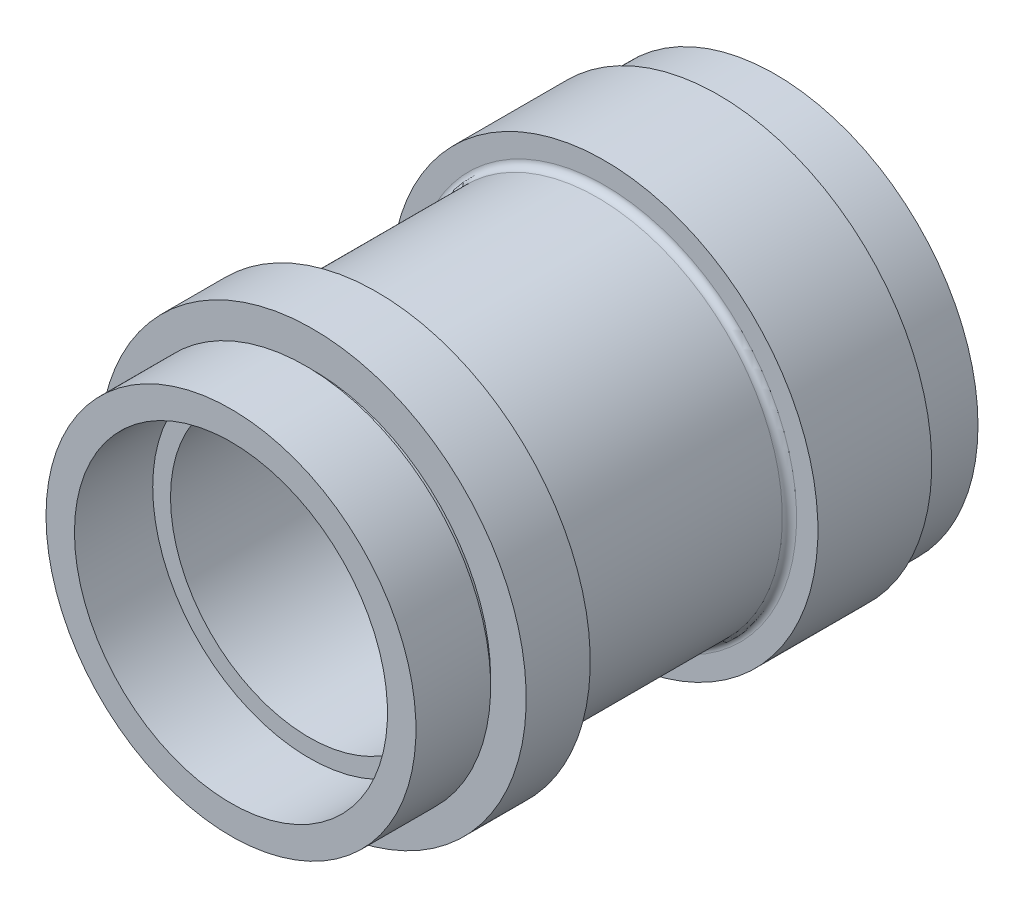
ISO-10303-21;
HEADER;
FILE_DESCRIPTION(('STEP AP214'),'2;1');
FILE_NAME('part.step','',(''),(''),'','','');
FILE_SCHEMA(('AUTOMOTIVE_DESIGN { 1 0 10303 214 1 1 1 1 }'));
ENDSEC;
DATA;
#1=APPLICATION_CONTEXT('core data for automotive mechanical design processes');
#2=APPLICATION_PROTOCOL_DEFINITION('international standard','automotive_design',2000,#1);
#3=PRODUCT_CONTEXT('',#1,'mechanical');
#4=PRODUCT('Part','Part','',(#3));
#5=PRODUCT_RELATED_PRODUCT_CATEGORY('part','',(#4));
#6=PRODUCT_DEFINITION_FORMATION('','',#4);
#7=PRODUCT_DEFINITION_CONTEXT('part definition',#1,'design');
#8=PRODUCT_DEFINITION('design','',#6,#7);
#9=PRODUCT_DEFINITION_SHAPE('','',#8);
#10=(LENGTH_UNIT() NAMED_UNIT(*) SI_UNIT(.MILLI.,.METRE.));
#11=(NAMED_UNIT(*) PLANE_ANGLE_UNIT() SI_UNIT($,.RADIAN.));
#12=(NAMED_UNIT(*) SI_UNIT($,.STERADIAN.) SOLID_ANGLE_UNIT());
#13=UNCERTAINTY_MEASURE_WITH_UNIT(LENGTH_MEASURE(1.E-05),#10,'distance_accuracy_value','');
#14=(GEOMETRIC_REPRESENTATION_CONTEXT(3) GLOBAL_UNCERTAINTY_ASSIGNED_CONTEXT((#13)) GLOBAL_UNIT_ASSIGNED_CONTEXT((#10,
#11,#12)) REPRESENTATION_CONTEXT('',''));
#15=CARTESIAN_POINT('',(0.,0.,0.));
#16=DIRECTION('',(0.,0.,1.));
#17=DIRECTION('',(1.,0.,0.));
#18=AXIS2_PLACEMENT_3D('',#15,#16,#17);
#19=CARTESIAN_POINT('',(0.,0.,32.5));
#20=DIRECTION('',(0.,0.,-1.));
#21=DIRECTION('',(-1.,0.,0.));
#22=AXIS2_PLACEMENT_3D('',#19,#20,#21);
#23=CYLINDRICAL_SURFACE('',#22,15.);
#24=CARTESIAN_POINT('',(0.,0.,28.));
#25=DIRECTION('',(0.,0.,-1.));
#26=DIRECTION('',(-1.,0.,0.));
#27=AXIS2_PLACEMENT_3D('',#24,#25,#26);
#28=CIRCLE('',#27,15.);
#29=CARTESIAN_POINT('',(-15.,0.,28.));
#30=VERTEX_POINT('',#29);
#31=EDGE_CURVE('E93',#30,#30,#28,.T.);
#32=CARTESIAN_POINT('',(0.,0.,32.5));
#33=DIRECTION('',(0.,0.,1.));
#34=DIRECTION('',(1.,0.,0.));
#35=AXIS2_PLACEMENT_3D('',#32,#33,#34);
#36=CIRCLE('',#35,15.);
#37=CARTESIAN_POINT('',(-15.,0.,32.5));
#38=VERTEX_POINT('',#37);
#39=EDGE_CURVE('E118',#38,#38,#36,.T.);
#40=CARTESIAN_POINT('',(-15.,0.,28.));
#41=CARTESIAN_POINT('',(-15.,0.,28.046875));
#42=CARTESIAN_POINT('',(-15.,0.,28.09375));
#43=CARTESIAN_POINT('',(-15.,0.,28.1875));
#44=CARTESIAN_POINT('',(-15.,0.,28.234375));
#45=CARTESIAN_POINT('',(-15.,0.,28.328125));
#46=CARTESIAN_POINT('',(-15.,0.,28.375));
#47=CARTESIAN_POINT('',(-15.,0.,28.46875));
#48=CARTESIAN_POINT('',(-15.,0.,28.515625));
#49=CARTESIAN_POINT('',(-15.,0.,28.609375));
#50=CARTESIAN_POINT('',(-15.,0.,28.65625));
#51=CARTESIAN_POINT('',(-15.,0.,28.75));
#52=CARTESIAN_POINT('',(-15.,0.,28.796875));
#53=CARTESIAN_POINT('',(-15.,0.,28.890625));
#54=CARTESIAN_POINT('',(-15.,0.,28.9375));
#55=CARTESIAN_POINT('',(-15.,0.,29.03125));
#56=CARTESIAN_POINT('',(-15.,0.,29.078125));
#57=CARTESIAN_POINT('',(-15.,0.,29.171875));
#58=CARTESIAN_POINT('',(-15.,0.,29.21875));
#59=CARTESIAN_POINT('',(-15.,0.,29.3125));
#60=CARTESIAN_POINT('',(-15.,0.,29.359375));
#61=CARTESIAN_POINT('',(-15.,0.,29.453125));
#62=CARTESIAN_POINT('',(-15.,0.,29.5));
#63=CARTESIAN_POINT('',(-15.,0.,29.59375));
#64=CARTESIAN_POINT('',(-15.,0.,29.640625));
#65=CARTESIAN_POINT('',(-15.,0.,29.734375));
#66=CARTESIAN_POINT('',(-15.,0.,29.78125));
#67=CARTESIAN_POINT('',(-15.,0.,29.875));
#68=CARTESIAN_POINT('',(-15.,0.,29.921875));
#69=CARTESIAN_POINT('',(-15.,0.,30.015625));
#70=CARTESIAN_POINT('',(-15.,0.,30.0625));
#71=CARTESIAN_POINT('',(-15.,0.,30.15625));
#72=CARTESIAN_POINT('',(-15.,0.,30.203125));
#73=CARTESIAN_POINT('',(-15.,0.,30.296875));
#74=CARTESIAN_POINT('',(-15.,0.,30.34375));
#75=CARTESIAN_POINT('',(-15.,0.,30.4375));
#76=CARTESIAN_POINT('',(-15.,0.,30.484375));
#77=CARTESIAN_POINT('',(-15.,0.,30.578125));
#78=CARTESIAN_POINT('',(-15.,0.,30.625));
#79=CARTESIAN_POINT('',(-15.,0.,30.71875));
#80=CARTESIAN_POINT('',(-15.,0.,30.765625));
#81=CARTESIAN_POINT('',(-15.,0.,30.859375));
#82=CARTESIAN_POINT('',(-15.,0.,30.90625));
#83=CARTESIAN_POINT('',(-15.,0.,31.));
#84=CARTESIAN_POINT('',(-15.,0.,31.046875));
#85=CARTESIAN_POINT('',(-15.,0.,31.140625));
#86=CARTESIAN_POINT('',(-15.,0.,31.1875));
#87=CARTESIAN_POINT('',(-15.,0.,31.28125));
#88=CARTESIAN_POINT('',(-15.,0.,31.328125));
#89=CARTESIAN_POINT('',(-15.,0.,31.421875));
#90=CARTESIAN_POINT('',(-15.,0.,31.46875));
#91=CARTESIAN_POINT('',(-15.,0.,31.5625));
#92=CARTESIAN_POINT('',(-15.,0.,31.609375));
#93=CARTESIAN_POINT('',(-15.,0.,31.703125));
#94=CARTESIAN_POINT('',(-15.,0.,31.75));
#95=CARTESIAN_POINT('',(-15.,0.,31.84375));
#96=CARTESIAN_POINT('',(-15.,0.,31.890625));
#97=CARTESIAN_POINT('',(-15.,0.,31.984375));
#98=CARTESIAN_POINT('',(-15.,0.,32.03125));
#99=CARTESIAN_POINT('',(-15.,0.,32.125));
#100=CARTESIAN_POINT('',(-15.,0.,32.171875));
#101=CARTESIAN_POINT('',(-15.,0.,32.265625));
#102=CARTESIAN_POINT('',(-15.,0.,32.3125));
#103=CARTESIAN_POINT('',(-15.,0.,32.40625));
#104=CARTESIAN_POINT('',(-15.,0.,32.453125));
#105=CARTESIAN_POINT('',(-15.,0.,32.5));
#106=B_SPLINE_CURVE_WITH_KNOTS('',3,(#40,#41,#42,#43,#44,#45,#46,#47,#48,#49,#50,#51,#52,#53,
#54,#55,#56,#57,#58,#59,#60,#61,#62,#63,#64,#65,#66,#67,#68,#69,#70,#71,#72,#73,#74,#75,#76,#77,
#78,#79,#80,#81,#82,#83,#84,#85,#86,#87,#88,#89,#90,#91,#92,#93,#94,#95,#96,#97,#98,#99,#100,
#101,#102,#103,#104,#105),.UNSPECIFIED.,.F.,.F.,(4,2,2,2,2,2,2,2,2,2,2,2,2,2,2,2,2,2,2,2,2,2,2,
2,2,2,2,2,2,2,2,2,4),(0.,0.140624999999998,0.28125,0.421874999999999,0.562499999999997,
0.703124999999999,0.843749999999997,0.984374999999996,1.125,1.265625,1.40624999999999,1.546875,
1.68749999999999,1.828125,1.96874999999999,2.10937499999999,2.25,2.39062499999999,2.53125,
2.67187499999999,2.81249999999999,2.95312499999999,3.09374999999999,3.23437499999999,
3.37499999999999,3.51562499999999,3.65624999999999,3.79687499999999,3.93749999999999,
4.07812499999999,4.21874999999999,4.35937499999999,4.49999999999999),.UNSPECIFIED.);
#107=EDGE_CURVE('BSEAM51',#30,#38,#106,.T.);
#108=ORIENTED_EDGE('',*,*,#31,.F.);
#109=ORIENTED_EDGE('',*,*,#39,.F.);
#110=ORIENTED_EDGE('',*,*,#107,.T.);
#111=ORIENTED_EDGE('',*,*,#107,.F.);
#112=EDGE_LOOP('',(#108,#110,#109,#111));
#113=FACE_BOUND('',#112,.T.);
#114=ADVANCED_FACE('F51',(#113),#23,.T.);
#115=CARTESIAN_POINT('',(0.,0.,32.5));
#116=DIRECTION('',(0.,0.,1.));
#117=DIRECTION('',(1.,0.,0.));
#118=AXIS2_PLACEMENT_3D('',#115,#116,#117);
#119=PLANE('',#118);
#120=CARTESIAN_POINT('',(0.,0.,32.5));
#121=DIRECTION('',(0.,0.,1.));
#122=DIRECTION('',(1.,0.,0.));
#123=AXIS2_PLACEMENT_3D('',#120,#121,#122);
#124=CIRCLE('',#123,12.5);
#125=CARTESIAN_POINT('',(12.5,0.,32.5));
#126=VERTEX_POINT('',#125);
#127=EDGE_CURVE('E11',#126,#126,#124,.T.);
#128=ORIENTED_EDGE('',*,*,#127,.F.);
#129=EDGE_LOOP('',(#128));
#130=FACE_BOUND('',#129,.T.);
#131=ORIENTED_EDGE('',*,*,#39,.T.);
#132=EDGE_LOOP('',(#131));
#133=FACE_BOUND('',#132,.T.);
#134=ADVANCED_FACE('F147',(#130,#133),#119,.T.);
#135=CARTESIAN_POINT('',(0.,0.,33.));
#136=DIRECTION('',(0.,0.,-1.));
#137=DIRECTION('',(-1.,0.,0.));
#138=AXIS2_PLACEMENT_3D('',#135,#136,#137);
#139=CYLINDRICAL_SURFACE('',#138,12.5);
#140=CARTESIAN_POINT('',(0.,0.,33.));
#141=DIRECTION('',(0.,0.,1.));
#142=DIRECTION('',(1.,0.,0.));
#143=AXIS2_PLACEMENT_3D('',#140,#141,#142);
#144=CIRCLE('',#143,12.5);
#145=CARTESIAN_POINT('',(12.5,0.,33.));
#146=VERTEX_POINT('',#145);
#147=EDGE_CURVE('E112',#146,#146,#144,.T.);
#148=ORIENTED_EDGE('',*,*,#147,.F.);
#149=EDGE_LOOP('',(#148));
#150=FACE_BOUND('',#149,.T.);
#151=ORIENTED_EDGE('',*,*,#127,.T.);
#152=EDGE_LOOP('',(#151));
#153=FACE_BOUND('',#152,.T.);
#154=ADVANCED_FACE('F154',(#150,#153),#139,.T.);
#155=CARTESIAN_POINT('',(0.,0.,38.25));
#156=DIRECTION('',(0.,0.,-1.));
#157=DIRECTION('',(-1.,0.,0.));
#158=AXIS2_PLACEMENT_3D('',#155,#156,#157);
#159=CYLINDRICAL_SURFACE('',#158,13.);
#160=CARTESIAN_POINT('',(0.,0.,38.25));
#161=DIRECTION('',(0.,0.,1.));
#162=DIRECTION('',(1.,0.,0.));
#163=AXIS2_PLACEMENT_3D('',#160,#161,#162);
#164=CIRCLE('',#163,13.);
#165=CARTESIAN_POINT('',(-13.,0.,38.25));
#166=VERTEX_POINT('',#165);
#167=EDGE_CURVE('E109',#166,#166,#164,.T.);
#168=CARTESIAN_POINT('',(0.,0.,33.));
#169=DIRECTION('',(0.,0.,1.));
#170=DIRECTION('',(1.,0.,0.));
#171=AXIS2_PLACEMENT_3D('',#168,#169,#170);
#172=CIRCLE('',#171,13.);
#173=CARTESIAN_POINT('',(-13.,0.,33.));
#174=VERTEX_POINT('',#173);
#175=EDGE_CURVE('E108',#174,#174,#172,.T.);
#176=CARTESIAN_POINT('',(-13.,0.,38.25));
#177=CARTESIAN_POINT('',(-13.,0.,38.1953125));
#178=CARTESIAN_POINT('',(-13.,0.,38.140625));
#179=CARTESIAN_POINT('',(-13.,0.,38.03125));
#180=CARTESIAN_POINT('',(-13.,0.,37.9765625));
#181=CARTESIAN_POINT('',(-13.,0.,37.8671875));
#182=CARTESIAN_POINT('',(-13.,0.,37.8125));
#183=CARTESIAN_POINT('',(-13.,0.,37.703125));
#184=CARTESIAN_POINT('',(-13.,0.,37.6484375));
#185=CARTESIAN_POINT('',(-13.,0.,37.5390625));
#186=CARTESIAN_POINT('',(-13.,0.,37.484375));
#187=CARTESIAN_POINT('',(-13.,0.,37.375));
#188=CARTESIAN_POINT('',(-13.,0.,37.3203125));
#189=CARTESIAN_POINT('',(-13.,0.,37.2109375));
#190=CARTESIAN_POINT('',(-13.,0.,37.15625));
#191=CARTESIAN_POINT('',(-13.,0.,37.046875));
#192=CARTESIAN_POINT('',(-13.,0.,36.9921875));
#193=CARTESIAN_POINT('',(-13.,0.,36.8828125));
#194=CARTESIAN_POINT('',(-13.,0.,36.828125));
#195=CARTESIAN_POINT('',(-13.,0.,36.71875));
#196=CARTESIAN_POINT('',(-13.,0.,36.6640625));
#197=CARTESIAN_POINT('',(-13.,0.,36.5546875));
#198=CARTESIAN_POINT('',(-13.,0.,36.5));
#199=CARTESIAN_POINT('',(-13.,0.,36.390625));
#200=CARTESIAN_POINT('',(-13.,0.,36.3359375));
#201=CARTESIAN_POINT('',(-13.,0.,36.2265625));
#202=CARTESIAN_POINT('',(-13.,0.,36.171875));
#203=CARTESIAN_POINT('',(-13.,0.,36.0625));
#204=CARTESIAN_POINT('',(-13.,0.,36.0078125));
#205=CARTESIAN_POINT('',(-13.,0.,35.8984375));
#206=CARTESIAN_POINT('',(-13.,0.,35.84375));
#207=CARTESIAN_POINT('',(-13.,0.,35.734375));
#208=CARTESIAN_POINT('',(-13.,0.,35.6796875));
#209=CARTESIAN_POINT('',(-13.,0.,35.5703125));
#210=CARTESIAN_POINT('',(-13.,0.,35.515625));
#211=CARTESIAN_POINT('',(-13.,0.,35.40625));
#212=CARTESIAN_POINT('',(-13.,0.,35.3515625));
#213=CARTESIAN_POINT('',(-13.,0.,35.2421875));
#214=CARTESIAN_POINT('',(-13.,0.,35.1875));
#215=CARTESIAN_POINT('',(-13.,0.,35.078125));
#216=CARTESIAN_POINT('',(-13.,0.,35.0234375));
#217=CARTESIAN_POINT('',(-13.,0.,34.9140625));
#218=CARTESIAN_POINT('',(-13.,0.,34.859375));
#219=CARTESIAN_POINT('',(-13.,0.,34.75));
#220=CARTESIAN_POINT('',(-13.,0.,34.6953125));
#221=CARTESIAN_POINT('',(-13.,0.,34.5859375));
#222=CARTESIAN_POINT('',(-13.,0.,34.53125));
#223=CARTESIAN_POINT('',(-13.,0.,34.421875));
#224=CARTESIAN_POINT('',(-13.,0.,34.3671875));
#225=CARTESIAN_POINT('',(-13.,0.,34.2578125));
#226=CARTESIAN_POINT('',(-13.,0.,34.203125));
#227=CARTESIAN_POINT('',(-13.,0.,34.09375));
#228=CARTESIAN_POINT('',(-13.,0.,34.0390625));
#229=CARTESIAN_POINT('',(-13.,0.,33.9296875));
#230=CARTESIAN_POINT('',(-13.,0.,33.875));
#231=CARTESIAN_POINT('',(-13.,0.,33.765625));
#232=CARTESIAN_POINT('',(-13.,0.,33.7109375));
#233=CARTESIAN_POINT('',(-13.,0.,33.6015625));
#234=CARTESIAN_POINT('',(-13.,0.,33.546875));
#235=CARTESIAN_POINT('',(-13.,0.,33.4375));
#236=CARTESIAN_POINT('',(-13.,0.,33.3828125));
#237=CARTESIAN_POINT('',(-13.,0.,33.2734375));
#238=CARTESIAN_POINT('',(-13.,0.,33.21875));
#239=CARTESIAN_POINT('',(-13.,0.,33.109375));
#240=CARTESIAN_POINT('',(-13.,0.,33.0546875));
#241=CARTESIAN_POINT('',(-13.,0.,33.));
#242=B_SPLINE_CURVE_WITH_KNOTS('',3,(#176,#177,#178,#179,#180,#181,#182,#183,#184,#185,#186,
#187,#188,#189,#190,#191,#192,#193,#194,#195,#196,#197,#198,#199,#200,#201,#202,#203,#204,#205,
#206,#207,#208,#209,#210,#211,#212,#213,#214,#215,#216,#217,#218,#219,#220,#221,#222,#223,#224,
#225,#226,#227,#228,#229,#230,#231,#232,#233,#234,#235,#236,#237,#238,#239,#240,#241),
.UNSPECIFIED.,.F.,.F.,(4,2,2,2,2,2,2,2,2,2,2,2,2,2,2,2,2,2,2,2,2,2,2,2,2,2,2,2,2,2,2,2,4),(0.,
0.164062500000006,0.328125000000005,0.492187500000005,0.656250000000004,0.820312500000003,
0.984375000000003,1.1484375,1.3125,1.4765625,1.640625,1.80468750000001,1.96875000000001,
2.1328125,2.296875,2.4609375,2.625,2.7890625,2.953125,3.1171875,3.28125,3.44531250000001,
3.609375,3.7734375,3.9375,4.1015625,4.265625,4.4296875,4.59375,4.7578125,4.921875,
5.08593750000001,5.25),.UNSPECIFIED.);
#243=EDGE_CURVE('BSEAM211',#166,#174,#242,.T.);
#244=ORIENTED_EDGE('',*,*,#167,.F.);
#245=ORIENTED_EDGE('',*,*,#175,.T.);
#246=ORIENTED_EDGE('',*,*,#243,.T.);
#247=ORIENTED_EDGE('',*,*,#243,.F.);
#248=EDGE_LOOP('',(#244,#246,#245,#247));
#249=FACE_BOUND('',#248,.T.);
#250=ADVANCED_FACE('F211',(#249),#159,.T.);
#251=CARTESIAN_POINT('',(0.,0.,38.25));
#252=DIRECTION('',(0.,0.,1.));
#253=DIRECTION('',(1.,0.,0.));
#254=AXIS2_PLACEMENT_3D('',#251,#252,#253);
#255=PLANE('',#254);
#256=CARTESIAN_POINT('',(0.,0.,38.25));
#257=DIRECTION('',(0.,0.,-1.));
#258=DIRECTION('',(-1.,0.,0.));
#259=AXIS2_PLACEMENT_3D('',#256,#257,#258);
#260=CIRCLE('',#259,11.);
#261=CARTESIAN_POINT('',(-11.,0.,38.25));
#262=VERTEX_POINT('',#261);
#263=EDGE_CURVE('E96',#262,#262,#260,.T.);
#264=ORIENTED_EDGE('',*,*,#263,.T.);
#265=EDGE_LOOP('',(#264));
#266=FACE_BOUND('',#265,.T.);
#267=ORIENTED_EDGE('',*,*,#167,.T.);
#268=EDGE_LOOP('',(#267));
#269=FACE_BOUND('',#268,.T.);
#270=ADVANCED_FACE('F209',(#266,#269),#255,.T.);
#271=CARTESIAN_POINT('',(0.,0.,33.));
#272=DIRECTION('',(0.,0.,1.));
#273=DIRECTION('',(1.,0.,0.));
#274=AXIS2_PLACEMENT_3D('',#271,#272,#273);
#275=PLANE('',#274);
#276=ORIENTED_EDGE('',*,*,#147,.T.);
#277=EDGE_LOOP('',(#276));
#278=FACE_BOUND('',#277,.T.);
#279=ORIENTED_EDGE('',*,*,#175,.F.);
#280=EDGE_LOOP('',(#279));
#281=FACE_BOUND('',#280,.T.);
#282=ADVANCED_FACE('F207',(#278,#281),#275,.F.);
#283=CARTESIAN_POINT('',(0.,0.,0.));
#284=DIRECTION('',(0.,0.,-1.));
#285=DIRECTION('',(-1.,0.,0.));
#286=AXIS2_PLACEMENT_3D('',#283,#284,#285);
#287=CYLINDRICAL_SURFACE('',#286,9.75);
#288=CARTESIAN_POINT('',(0.,0.,32.75));
#289=DIRECTION('',(0.,0.,-1.));
#290=DIRECTION('',(-1.,0.,0.));
#291=AXIS2_PLACEMENT_3D('',#288,#289,#290);
#292=CIRCLE('',#291,9.75);
#293=CARTESIAN_POINT('',(-9.75,0.,32.75));
#294=VERTEX_POINT('',#293);
#295=EDGE_CURVE('E102',#294,#294,#292,.T.);
#296=ORIENTED_EDGE('',*,*,#295,.F.);
#297=EDGE_LOOP('',(#296));
#298=FACE_BOUND('',#297,.T.);
#299=CARTESIAN_POINT('',(0.,0.,0.));
#300=DIRECTION('',(0.,0.,-1.));
#301=DIRECTION('',(-1.,0.,0.));
#302=AXIS2_PLACEMENT_3D('',#299,#300,#301);
#303=CIRCLE('',#302,9.75);
#304=CARTESIAN_POINT('',(-9.75,0.,0.));
#305=VERTEX_POINT('',#304);
#306=EDGE_CURVE('E105',#305,#305,#303,.T.);
#307=ORIENTED_EDGE('',*,*,#306,.T.);
#308=EDGE_LOOP('',(#307));
#309=FACE_BOUND('',#308,.T.);
#310=ADVANCED_FACE('F203',(#298,#309),#287,.F.);
#311=CARTESIAN_POINT('',(0.,9.75,32.75));
#312=DIRECTION('',(0.,0.,-1.));
#313=DIRECTION('',(-1.,0.,0.));
#314=AXIS2_PLACEMENT_3D('',#311,#312,#313);
#315=PLANE('',#314);
#316=CARTESIAN_POINT('',(0.,0.,32.75));
#317=DIRECTION('',(0.,0.,-1.));
#318=DIRECTION('',(-1.,0.,0.));
#319=AXIS2_PLACEMENT_3D('',#316,#317,#318);
#320=CIRCLE('',#319,11.);
#321=CARTESIAN_POINT('',(-11.,0.,32.75));
#322=VERTEX_POINT('',#321);
#323=EDGE_CURVE('E99',#322,#322,#320,.T.);
#324=ORIENTED_EDGE('',*,*,#323,.F.);
#325=EDGE_LOOP('',(#324));
#326=FACE_BOUND('',#325,.T.);
#327=ORIENTED_EDGE('',*,*,#295,.T.);
#328=EDGE_LOOP('',(#327));
#329=FACE_BOUND('',#328,.T.);
#330=ADVANCED_FACE('F199',(#326,#329),#315,.F.);
#331=CARTESIAN_POINT('',(0.,0.,0.));
#332=DIRECTION('',(0.,0.,-1.));
#333=DIRECTION('',(-1.,0.,0.));
#334=AXIS2_PLACEMENT_3D('',#331,#332,#333);
#335=CYLINDRICAL_SURFACE('',#334,11.);
#336=ORIENTED_EDGE('',*,*,#263,.F.);
#337=EDGE_LOOP('',(#336));
#338=FACE_BOUND('',#337,.T.);
#339=ORIENTED_EDGE('',*,*,#323,.T.);
#340=EDGE_LOOP('',(#339));
#341=FACE_BOUND('',#340,.T.);
#342=ADVANCED_FACE('F167',(#338,#341),#335,.F.);
#343=CARTESIAN_POINT('',(0.,0.,4.));
#344=DIRECTION('',(0.,0.,1.));
#345=DIRECTION('',(1.,0.,0.));
#346=AXIS2_PLACEMENT_3D('',#343,#344,#345);
#347=PLANE('',#346);
#348=CARTESIAN_POINT('',(0.,0.,4.));
#349=DIRECTION('',(0.,0.,1.));
#350=DIRECTION('',(1.,0.,0.));
#351=AXIS2_PLACEMENT_3D('',#348,#349,#350);
#352=CIRCLE('',#351,14.25);
#353=CARTESIAN_POINT('',(14.25,0.,4.));
#354=VERTEX_POINT('',#353);
#355=EDGE_CURVE('E59',#354,#354,#352,.T.);
#356=ORIENTED_EDGE('',*,*,#355,.T.);
#357=EDGE_LOOP('',(#356));
#358=FACE_BOUND('',#357,.T.);
#359=CARTESIAN_POINT('',(0.,0.,4.));
#360=DIRECTION('',(0.,0.,1.));
#361=DIRECTION('',(1.,0.,0.));
#362=AXIS2_PLACEMENT_3D('',#359,#360,#361);
#363=CIRCLE('',#362,15.);
#364=CARTESIAN_POINT('',(-15.,0.,4.));
#365=VERTEX_POINT('',#364);
#366=EDGE_CURVE('E116',#365,#365,#363,.T.);
#367=ORIENTED_EDGE('',*,*,#366,.F.);
#368=EDGE_LOOP('',(#367));
#369=FACE_BOUND('',#368,.T.);
#370=ADVANCED_FACE('F161',(#358,#369),#347,.F.);
#371=CARTESIAN_POINT('',(0.,0.,12.));
#372=DIRECTION('',(0.,0.,-1.));
#373=DIRECTION('',(-1.,0.,0.));
#374=AXIS2_PLACEMENT_3D('',#371,#372,#373);
#375=CIRCLE('',#374,15.);
#376=CARTESIAN_POINT('',(-15.,0.,12.));
#377=VERTEX_POINT('',#376);
#378=EDGE_CURVE('E90',#377,#377,#375,.T.);
#379=CARTESIAN_POINT('',(-15.,0.,12.));
#380=CARTESIAN_POINT('',(-15.,0.,11.9166666666667));
#381=CARTESIAN_POINT('',(-15.,0.,11.8333333333333));
#382=CARTESIAN_POINT('',(-15.,0.,11.6666666666667));
#383=CARTESIAN_POINT('',(-15.,0.,11.5833333333333));
#384=CARTESIAN_POINT('',(-15.,0.,11.4166666666667));
#385=CARTESIAN_POINT('',(-15.,0.,11.3333333333333));
#386=CARTESIAN_POINT('',(-15.,0.,11.1666666666667));
#387=CARTESIAN_POINT('',(-15.,0.,11.0833333333333));
#388=CARTESIAN_POINT('',(-15.,0.,10.9166666666667));
#389=CARTESIAN_POINT('',(-15.,0.,10.8333333333333));
#390=CARTESIAN_POINT('',(-15.,0.,10.6666666666667));
#391=CARTESIAN_POINT('',(-15.,0.,10.5833333333333));
#392=CARTESIAN_POINT('',(-15.,0.,10.4166666666667));
#393=CARTESIAN_POINT('',(-15.,0.,10.3333333333333));
#394=CARTESIAN_POINT('',(-15.,0.,10.1666666666667));
#395=CARTESIAN_POINT('',(-15.,0.,10.0833333333333));
#396=CARTESIAN_POINT('',(-15.,0.,9.91666666666667));
#397=CARTESIAN_POINT('',(-15.,0.,9.83333333333334));
#398=CARTESIAN_POINT('',(-15.,0.,9.66666666666667));
#399=CARTESIAN_POINT('',(-15.,0.,9.58333333333334));
#400=CARTESIAN_POINT('',(-15.,0.,9.41666666666667));
#401=CARTESIAN_POINT('',(-15.,0.,9.33333333333334));
#402=CARTESIAN_POINT('',(-15.,0.,9.16666666666667));
#403=CARTESIAN_POINT('',(-15.,0.,9.08333333333334));
#404=CARTESIAN_POINT('',(-15.,0.,8.91666666666667));
#405=CARTESIAN_POINT('',(-15.,0.,8.83333333333334));
#406=CARTESIAN_POINT('',(-15.,0.,8.66666666666667));
#407=CARTESIAN_POINT('',(-15.,0.,8.58333333333334));
#408=CARTESIAN_POINT('',(-15.,0.,8.41666666666667));
#409=CARTESIAN_POINT('',(-15.,0.,8.33333333333334));
#410=CARTESIAN_POINT('',(-15.,0.,8.16666666666667));
#411=CARTESIAN_POINT('',(-15.,0.,8.08333333333334));
#412=CARTESIAN_POINT('',(-15.,0.,7.91666666666667));
#413=CARTESIAN_POINT('',(-15.,0.,7.83333333333334));
#414=CARTESIAN_POINT('',(-15.,0.,7.66666666666667));
#415=CARTESIAN_POINT('',(-15.,0.,7.58333333333334));
#416=CARTESIAN_POINT('',(-15.,0.,7.41666666666667));
#417=CARTESIAN_POINT('',(-15.,0.,7.33333333333334));
#418=CARTESIAN_POINT('',(-15.,0.,7.16666666666667));
#419=CARTESIAN_POINT('',(-15.,0.,7.08333333333334));
#420=CARTESIAN_POINT('',(-15.,0.,6.91666666666667));
#421=CARTESIAN_POINT('',(-15.,0.,6.83333333333334));
#422=CARTESIAN_POINT('',(-15.,0.,6.66666666666667));
#423=CARTESIAN_POINT('',(-15.,0.,6.58333333333334));
#424=CARTESIAN_POINT('',(-15.,0.,6.41666666666667));
#425=CARTESIAN_POINT('',(-15.,0.,6.33333333333334));
#426=CARTESIAN_POINT('',(-15.,0.,6.16666666666667));
#427=CARTESIAN_POINT('',(-15.,0.,6.08333333333334));
#428=CARTESIAN_POINT('',(-15.,0.,5.91666666666667));
#429=CARTESIAN_POINT('',(-15.,0.,5.83333333333334));
#430=CARTESIAN_POINT('',(-15.,0.,5.66666666666667));
#431=CARTESIAN_POINT('',(-15.,0.,5.58333333333333));
#432=CARTESIAN_POINT('',(-15.,0.,5.41666666666667));
#433=CARTESIAN_POINT('',(-15.,0.,5.33333333333333));
#434=CARTESIAN_POINT('',(-15.,0.,5.16666666666667));
#435=CARTESIAN_POINT('',(-15.,0.,5.08333333333333));
#436=CARTESIAN_POINT('',(-15.,0.,4.91666666666667));
#437=CARTESIAN_POINT('',(-15.,0.,4.83333333333333));
#438=CARTESIAN_POINT('',(-15.,0.,4.66666666666667));
#439=CARTESIAN_POINT('',(-15.,0.,4.58333333333333));
#440=CARTESIAN_POINT('',(-15.,0.,4.41666666666667));
#441=CARTESIAN_POINT('',(-15.,0.,4.33333333333333));
#442=CARTESIAN_POINT('',(-15.,0.,4.16666666666667));
#443=CARTESIAN_POINT('',(-15.,0.,4.08333333333333));
#444=CARTESIAN_POINT('',(-15.,0.,4.));
#445=B_SPLINE_CURVE_WITH_KNOTS('',3,(#379,#380,#381,#382,#383,#384,#385,#386,#387,#388,#389,
#390,#391,#392,#393,#394,#395,#396,#397,#398,#399,#400,#401,#402,#403,#404,#405,#406,#407,#408,
#409,#410,#411,#412,#413,#414,#415,#416,#417,#418,#419,#420,#421,#422,#423,#424,#425,#426,#427,
#428,#429,#430,#431,#432,#433,#434,#435,#436,#437,#438,#439,#440,#441,#442,#443,#444),
.UNSPECIFIED.,.F.,.F.,(4,2,2,2,2,2,2,2,2,2,2,2,2,2,2,2,2,2,2,2,2,2,2,2,2,2,2,2,2,2,2,2,4),(0.,
0.25,0.5,0.750000000000001,1.,1.25,1.5,1.75,2.,2.25,2.5,2.75,3.,3.25,3.5,3.75,4.,4.25,4.5,4.75,
5.,5.25,5.50000000000001,5.75000000000001,6.00000000000001,6.25000000000001,6.50000000000001,
6.75000000000001,7.00000000000001,7.25000000000001,7.50000000000001,7.75000000000001,
8.00000000000001),.UNSPECIFIED.);
#446=EDGE_CURVE('BSEAM141',#377,#365,#445,.T.);
#447=ORIENTED_EDGE('',*,*,#378,.T.);
#448=ORIENTED_EDGE('',*,*,#366,.T.);
#449=ORIENTED_EDGE('',*,*,#446,.T.);
#450=ORIENTED_EDGE('',*,*,#446,.F.);
#451=EDGE_LOOP('',(#447,#449,#448,#450));
#452=FACE_BOUND('',#451,.T.);
#453=ADVANCED_FACE('F141',(#452),#23,.T.);
#454=CARTESIAN_POINT('',(0.,0.,4.));
#455=DIRECTION('',(0.,0.,-1.));
#456=DIRECTION('',(-1.,0.,0.));
#457=AXIS2_PLACEMENT_3D('',#454,#455,#456);
#458=CYLINDRICAL_SURFACE('',#457,14.25);
#459=ORIENTED_EDGE('',*,*,#355,.F.);
#460=EDGE_LOOP('',(#459));
#461=FACE_BOUND('',#460,.T.);
#462=CARTESIAN_POINT('',(0.,0.,0.));
#463=DIRECTION('',(0.,0.,1.));
#464=DIRECTION('',(1.,0.,0.));
#465=AXIS2_PLACEMENT_3D('',#462,#463,#464);
#466=CIRCLE('',#465,14.25);
#467=CARTESIAN_POINT('',(14.25,0.,0.));
#468=VERTEX_POINT('',#467);
#469=EDGE_CURVE('E55',#468,#468,#466,.T.);
#470=ORIENTED_EDGE('',*,*,#469,.T.);
#471=EDGE_LOOP('',(#470));
#472=FACE_BOUND('',#471,.T.);
#473=ADVANCED_FACE('F53',(#461,#472),#458,.T.);
#474=CARTESIAN_POINT('',(0.,0.,0.));
#475=DIRECTION('',(0.,0.,1.));
#476=DIRECTION('',(1.,0.,0.));
#477=AXIS2_PLACEMENT_3D('',#474,#475,#476);
#478=PLANE('',#477);
#479=CARTESIAN_POINT('',(0.,12.75,0.));
#480=DIRECTION('',(0.,0.,-1.));
#481=DIRECTION('',(-1.,0.,0.));
#482=AXIS2_PLACEMENT_3D('',#479,#480,#481);
#483=CIRCLE('',#482,0.999999999999989);
#484=CARTESIAN_POINT('',(-0.999999999999989,12.75,0.));
#485=VERTEX_POINT('',#484);
#486=EDGE_CURVE('E74',#485,#485,#483,.T.);
#487=ORIENTED_EDGE('',*,*,#486,.F.);
#488=EDGE_LOOP('',(#487));
#489=FACE_BOUND('',#488,.T.);
#490=ORIENTED_EDGE('',*,*,#306,.F.);
#491=EDGE_LOOP('',(#490));
#492=FACE_BOUND('',#491,.T.);
#493=ORIENTED_EDGE('',*,*,#469,.F.);
#494=EDGE_LOOP('',(#493));
#495=FACE_BOUND('',#494,.T.);
#496=ADVANCED_FACE('F129',(#489,#492,#495),#478,.F.);
#497=CARTESIAN_POINT('',(0.,15.,28.));
#498=DIRECTION('',(0.,0.,1.));
#499=DIRECTION('',(1.,0.,0.));
#500=AXIS2_PLACEMENT_3D('',#497,#498,#499);
#501=PLANE('',#500);
#502=CARTESIAN_POINT('',(0.,0.,28.));
#503=DIRECTION('',(0.,0.,-1.));
#504=DIRECTION('',(-1.,0.,0.));
#505=AXIS2_PLACEMENT_3D('',#502,#503,#504);
#506=CIRCLE('',#505,13.5);
#507=CARTESIAN_POINT('',(-13.5,0.,28.));
#508=VERTEX_POINT('',#507);
#509=EDGE_CURVE('E73',#508,#508,#506,.T.);
#510=ORIENTED_EDGE('',*,*,#509,.F.);
#511=EDGE_LOOP('',(#510));
#512=FACE_BOUND('',#511,.T.);
#513=ORIENTED_EDGE('',*,*,#31,.T.);
#514=EDGE_LOOP('',(#513));
#515=FACE_BOUND('',#514,.T.);
#516=ADVANCED_FACE('F131',(#512,#515),#501,.F.);
#517=CARTESIAN_POINT('',(0.,15.,12.));
#518=DIRECTION('',(0.,0.,-1.));
#519=DIRECTION('',(-1.,0.,0.));
#520=AXIS2_PLACEMENT_3D('',#517,#518,#519);
#521=PLANE('',#520);
#522=ORIENTED_EDGE('',*,*,#378,.F.);
#523=EDGE_LOOP('',(#522));
#524=FACE_BOUND('',#523,.T.);
#525=CARTESIAN_POINT('',(0.,0.,12.));
#526=DIRECTION('',(0.,0.,-1.));
#527=DIRECTION('',(-1.,0.,0.));
#528=AXIS2_PLACEMENT_3D('',#525,#526,#527);
#529=CIRCLE('',#528,13.5);
#530=CARTESIAN_POINT('',(-13.5,0.,12.));
#531=VERTEX_POINT('',#530);
#532=EDGE_CURVE('E87',#531,#531,#529,.T.);
#533=ORIENTED_EDGE('',*,*,#532,.T.);
#534=EDGE_LOOP('',(#533));
#535=FACE_BOUND('',#534,.T.);
#536=ADVANCED_FACE('F137',(#524,#535),#521,.F.);
#537=CARTESIAN_POINT('',(0.,0.,12.5));
#538=DIRECTION('',(0.,0.,-1.));
#539=DIRECTION('',(-1.,0.,0.));
#540=AXIS2_PLACEMENT_3D('',#537,#538,#539);
#541=TOROIDAL_SURFACE('',#540,13.5,0.5);
#542=ORIENTED_EDGE('',*,*,#532,.F.);
#543=EDGE_LOOP('',(#542));
#544=FACE_BOUND('',#543,.T.);
#545=CARTESIAN_POINT('',(0.,0.,12.5));
#546=DIRECTION('',(0.,0.,-1.));
#547=DIRECTION('',(-1.,0.,0.));
#548=AXIS2_PLACEMENT_3D('',#545,#546,#547);
#549=CIRCLE('',#548,13.);
#550=CARTESIAN_POINT('',(-13.,0.,12.5));
#551=VERTEX_POINT('',#550);
#552=EDGE_CURVE('E84',#551,#551,#549,.T.);
#553=ORIENTED_EDGE('',*,*,#552,.T.);
#554=EDGE_LOOP('',(#553));
#555=FACE_BOUND('',#554,.T.);
#556=ADVANCED_FACE('F175',(#544,#555),#541,.F.);
#557=CARTESIAN_POINT('',(0.,0.,0.));
#558=DIRECTION('',(0.,0.,-1.));
#559=DIRECTION('',(-1.,0.,0.));
#560=AXIS2_PLACEMENT_3D('',#557,#558,#559);
#561=CYLINDRICAL_SURFACE('',#560,13.);
#562=ORIENTED_EDGE('',*,*,#552,.F.);
#563=EDGE_LOOP('',(#562));
#564=FACE_BOUND('',#563,.T.);
#565=CARTESIAN_POINT('',(0.,0.,27.5));
#566=DIRECTION('',(0.,0.,-1.));
#567=DIRECTION('',(-1.,0.,0.));
#568=AXIS2_PLACEMENT_3D('',#565,#566,#567);
#569=CIRCLE('',#568,13.);
#570=CARTESIAN_POINT('',(-13.,0.,27.5));
#571=VERTEX_POINT('',#570);
#572=EDGE_CURVE('E77',#571,#571,#569,.T.);
#573=ORIENTED_EDGE('',*,*,#572,.T.);
#574=EDGE_LOOP('',(#573));
#575=FACE_BOUND('',#574,.T.);
#576=ADVANCED_FACE('F181',(#564,#575),#561,.T.);
#577=CARTESIAN_POINT('',(0.,0.,27.5));
#578=DIRECTION('',(0.,0.,-1.));
#579=DIRECTION('',(-1.,0.,0.));
#580=AXIS2_PLACEMENT_3D('',#577,#578,#579);
#581=TOROIDAL_SURFACE('',#580,13.5,0.5);
#582=ORIENTED_EDGE('',*,*,#572,.F.);
#583=EDGE_LOOP('',(#582));
#584=FACE_BOUND('',#583,.T.);
#585=ORIENTED_EDGE('',*,*,#509,.T.);
#586=EDGE_LOOP('',(#585));
#587=FACE_BOUND('',#586,.T.);
#588=ADVANCED_FACE('F67',(#584,#587),#581,.F.);
#589=CARTESIAN_POINT('',(0.,12.75,9.));
#590=DIRECTION('',(0.,0.,-1.));
#591=DIRECTION('',(-1.,0.,0.));
#592=AXIS2_PLACEMENT_3D('',#589,#590,#591);
#593=CONICAL_SURFACE('',#592,0.999999999999999,1.02974425867665);
#594=CARTESIAN_POINT('',(0.,12.75,9.60086061902756));
#595=VERTEX_POINT('',#594);
#596=VERTEX_LOOP('',#595);
#597=FACE_BOUND('',#596,.T.);
#598=CARTESIAN_POINT('',(0.,12.75,9.));
#599=DIRECTION('',(0.,0.,-1.));
#600=DIRECTION('',(-1.,0.,0.));
#601=AXIS2_PLACEMENT_3D('',#598,#599,#600);
#602=CIRCLE('',#601,0.999999999999999);
#603=CARTESIAN_POINT('',(-0.999999999999999,12.75,9.));
#604=VERTEX_POINT('',#603);
#605=EDGE_CURVE('E71',#604,#604,#602,.T.);
#606=ORIENTED_EDGE('',*,*,#605,.T.);
#607=EDGE_LOOP('',(#606));
#608=FACE_BOUND('',#607,.T.);
#609=ADVANCED_FACE('F63',(#597,#608),#593,.F.);
#610=CARTESIAN_POINT('',(0.,12.75,0.));
#611=DIRECTION('',(0.,0.,-1.));
#612=DIRECTION('',(-1.,0.,0.));
#613=AXIS2_PLACEMENT_3D('',#610,#611,#612);
#614=CYLINDRICAL_SURFACE('',#613,0.999999999999994);
#615=ORIENTED_EDGE('',*,*,#605,.F.);
#616=EDGE_LOOP('',(#615));
#617=FACE_BOUND('',#616,.T.);
#618=ORIENTED_EDGE('',*,*,#486,.T.);
#619=EDGE_LOOP('',(#618));
#620=FACE_BOUND('',#619,.T.);
#621=ADVANCED_FACE('F66',(#617,#620),#614,.F.);
#622=CLOSED_SHELL('',(#114,#134,#154,#250,#270,#282,#310,#330,#342,#370,#453,#473,#496,#516,
#536,#556,#576,#588,#609,#621));
#623=MANIFOLD_SOLID_BREP('B2',#622);
#624=ADVANCED_BREP_SHAPE_REPRESENTATION('',(#18,#623),#14);
#625=SHAPE_DEFINITION_REPRESENTATION(#9,#624);
ENDSEC;
END-ISO-10303-21;
